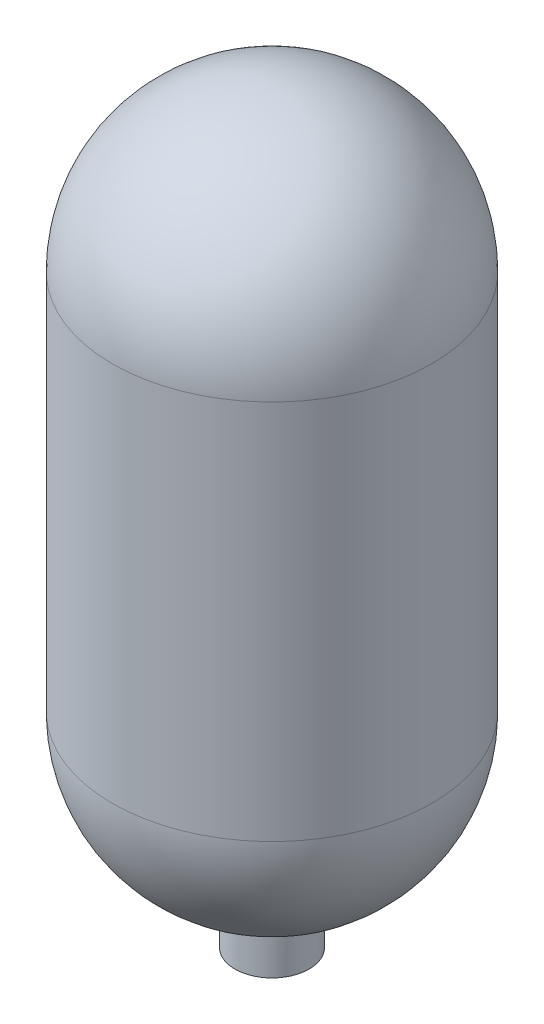
ISO-10303-21;
HEADER;
FILE_DESCRIPTION(('STEP AP214'),'2;1');
FILE_NAME('part.step','',(''),(''),'','','');
FILE_SCHEMA(('AUTOMOTIVE_DESIGN { 1 0 10303 214 1 1 1 1 }'));
ENDSEC;
DATA;
#1=APPLICATION_CONTEXT('core data for automotive mechanical design processes');
#2=APPLICATION_PROTOCOL_DEFINITION('international standard','automotive_design',2000,#1);
#3=PRODUCT_CONTEXT('',#1,'mechanical');
#4=PRODUCT('Part','Part','',(#3));
#5=PRODUCT_RELATED_PRODUCT_CATEGORY('part','',(#4));
#6=PRODUCT_DEFINITION_FORMATION('','',#4);
#7=PRODUCT_DEFINITION_CONTEXT('part definition',#1,'design');
#8=PRODUCT_DEFINITION('design','',#6,#7);
#9=PRODUCT_DEFINITION_SHAPE('','',#8);
#10=(LENGTH_UNIT() NAMED_UNIT(*) SI_UNIT(.MILLI.,.METRE.));
#11=(NAMED_UNIT(*) PLANE_ANGLE_UNIT() SI_UNIT($,.RADIAN.));
#12=(NAMED_UNIT(*) SI_UNIT($,.STERADIAN.) SOLID_ANGLE_UNIT());
#13=UNCERTAINTY_MEASURE_WITH_UNIT(LENGTH_MEASURE(1.E-05),#10,'distance_accuracy_value','');
#14=(GEOMETRIC_REPRESENTATION_CONTEXT(3) GLOBAL_UNCERTAINTY_ASSIGNED_CONTEXT((#13)) GLOBAL_UNIT_ASSIGNED_CONTEXT((#10,
#11,#12)) REPRESENTATION_CONTEXT('',''));
#15=CARTESIAN_POINT('',(0.,0.,0.));
#16=DIRECTION('',(0.,0.,1.));
#17=DIRECTION('',(1.,0.,0.));
#18=AXIS2_PLACEMENT_3D('',#15,#16,#17);
#19=CARTESIAN_POINT('',(0.,0.,0.));
#20=DIRECTION('',(0.,-1.,0.));
#21=DIRECTION('',(0.,0.,-1.));
#22=AXIS2_PLACEMENT_3D('',#19,#20,#21);
#23=PLANE('',#22);
#24=CARTESIAN_POINT('',(0.,0.,0.));
#25=DIRECTION('',(0.,-1.,0.));
#26=DIRECTION('',(0.,0.,-1.));
#27=AXIS2_PLACEMENT_3D('',#24,#25,#26);
#28=CIRCLE('',#27,8.24999999999999);
#29=CARTESIAN_POINT('',(0.,0.,-8.24999999999999));
#30=VERTEX_POINT('',#29);
#31=EDGE_CURVE('E58',#30,#30,#28,.T.);
#32=ORIENTED_EDGE('',*,*,#31,.F.);
#33=EDGE_LOOP('',(#32));
#34=FACE_BOUND('',#33,.T.);
#35=CARTESIAN_POINT('',(0.,0.,0.));
#36=DIRECTION('',(0.,-1.,0.));
#37=DIRECTION('',(0.,0.,-1.));
#38=AXIS2_PLACEMENT_3D('',#35,#36,#37);
#39=CIRCLE('',#38,15.);
#40=CARTESIAN_POINT('',(0.,0.,-15.));
#41=VERTEX_POINT('',#40);
#42=EDGE_CURVE('E46',#41,#41,#39,.T.);
#43=ORIENTED_EDGE('',*,*,#42,.T.);
#44=EDGE_LOOP('',(#43));
#45=FACE_BOUND('',#44,.T.);
#46=ADVANCED_FACE('F35',(#34,#45),#23,.T.);
#47=CARTESIAN_POINT('',(0.,0.,0.));
#48=DIRECTION('',(0.,-1.,0.));
#49=DIRECTION('',(0.,0.,-1.));
#50=AXIS2_PLACEMENT_3D('',#47,#48,#49);
#51=CYLINDRICAL_SURFACE('',#50,15.);
#52=CARTESIAN_POINT('',(0.,16.1714478019781,0.));
#53=DIRECTION('',(0.,1.,0.));
#54=DIRECTION('',(0.,0.,1.));
#55=AXIS2_PLACEMENT_3D('',#52,#53,#54);
#56=CIRCLE('',#55,15.);
#57=CARTESIAN_POINT('',(0.,16.1714478019781,15.));
#58=VERTEX_POINT('',#57);
#59=EDGE_CURVE('E42',#58,#58,#56,.F.);
#60=ORIENTED_EDGE('',*,*,#59,.T.);
#61=EDGE_LOOP('',(#60));
#62=FACE_BOUND('',#61,.T.);
#63=ORIENTED_EDGE('',*,*,#42,.F.);
#64=EDGE_LOOP('',(#63));
#65=FACE_BOUND('',#64,.T.);
#66=ADVANCED_FACE('F108',(#62,#65),#51,.T.);
#67=CARTESIAN_POINT('',(0.,82.7315709989795,0.));
#68=DIRECTION('',(0.,-1.,0.));
#69=DIRECTION('',(1.,0.,0.));
#70=AXIS2_PLACEMENT_3D('',#67,#68,#69);
#71=SPHERICAL_SURFACE('',#70,64.5);
#72=CARTESIAN_POINT('',(0.,20.9599458737048,0.));
#73=DIRECTION('',(0.,1.,0.));
#74=DIRECTION('',(0.,0.,1.));
#75=AXIS2_PLACEMENT_3D('',#72,#73,#74);
#76=CIRCLE('',#75,18.5611510791367);
#77=CARTESIAN_POINT('',(0.,20.9599458737048,18.5611510791367));
#78=VERTEX_POINT('',#77);
#79=EDGE_CURVE('E10',#78,#78,#76,.T.);
#80=ORIENTED_EDGE('',*,*,#79,.T.);
#81=EDGE_LOOP('',(#80));
#82=FACE_BOUND('',#81,.T.);
#83=CARTESIAN_POINT('',(0.,82.7315709989795,0.));
#84=DIRECTION('',(0.,-1.,0.));
#85=DIRECTION('',(0.,0.,-1.));
#86=AXIS2_PLACEMENT_3D('',#83,#84,#85);
#87=CIRCLE('',#86,64.5);
#88=CARTESIAN_POINT('',(0.,82.7315709989795,-64.5));
#89=VERTEX_POINT('',#88);
#90=EDGE_CURVE('E50',#89,#89,#87,.T.);
#91=ORIENTED_EDGE('',*,*,#90,.T.);
#92=EDGE_LOOP('',(#91));
#93=FACE_BOUND('',#92,.T.);
#94=ADVANCED_FACE('F113',(#82,#93),#71,.T.);
#95=CARTESIAN_POINT('',(0.,0.,0.));
#96=DIRECTION('',(0.,-1.,0.));
#97=DIRECTION('',(0.,0.,-1.));
#98=AXIS2_PLACEMENT_3D('',#95,#96,#97);
#99=CYLINDRICAL_SURFACE('',#98,64.5);
#100=CARTESIAN_POINT('',(0.,236.5,0.));
#101=DIRECTION('',(0.,-1.,0.));
#102=DIRECTION('',(0.,0.,-1.));
#103=AXIS2_PLACEMENT_3D('',#100,#101,#102);
#104=CIRCLE('',#103,64.5);
#105=CARTESIAN_POINT('',(0.,236.5,-64.5));
#106=VERTEX_POINT('',#105);
#107=EDGE_CURVE('E55',#106,#106,#104,.T.);
#108=ORIENTED_EDGE('',*,*,#107,.T.);
#109=EDGE_LOOP('',(#108));
#110=FACE_BOUND('',#109,.T.);
#111=ORIENTED_EDGE('',*,*,#90,.F.);
#112=EDGE_LOOP('',(#111));
#113=FACE_BOUND('',#112,.T.);
#114=ADVANCED_FACE('F104',(#110,#113),#99,.T.);
#115=CARTESIAN_POINT('',(0.,236.5,0.));
#116=DIRECTION('',(0.,-1.,0.));
#117=DIRECTION('',(1.,0.,0.));
#118=AXIS2_PLACEMENT_3D('',#115,#116,#117);
#119=SPHERICAL_SURFACE('',#118,64.5);
#120=ORIENTED_EDGE('',*,*,#107,.F.);
#121=EDGE_LOOP('',(#120));
#122=FACE_BOUND('',#121,.T.);
#123=ADVANCED_FACE('F96',(#122),#119,.T.);
#124=CARTESIAN_POINT('',(0.,0.,0.));
#125=DIRECTION('',(0.,-1.,0.));
#126=DIRECTION('',(0.,0.,-1.));
#127=AXIS2_PLACEMENT_3D('',#124,#125,#126);
#128=CYLINDRICAL_SURFACE('',#127,8.24999999999999);
#129=ORIENTED_EDGE('',*,*,#31,.T.);
#130=EDGE_LOOP('',(#129));
#131=FACE_BOUND('',#130,.T.);
#132=CARTESIAN_POINT('',(0.,25.7484439454315,0.));
#133=DIRECTION('',(0.,-1.,0.));
#134=DIRECTION('',(0.,0.,-1.));
#135=AXIS2_PLACEMENT_3D('',#132,#133,#134);
#136=CIRCLE('',#135,8.24999999999999);
#137=CARTESIAN_POINT('',(0.,25.7484439454315,-8.24999999999999));
#138=VERTEX_POINT('',#137);
#139=EDGE_CURVE('E61',#138,#138,#136,.T.);
#140=ORIENTED_EDGE('',*,*,#139,.F.);
#141=EDGE_LOOP('',(#140));
#142=FACE_BOUND('',#141,.T.);
#143=ADVANCED_FACE('F94',(#131,#142),#128,.F.);
#144=CARTESIAN_POINT('',(0.,16.1714478019781,0.));
#145=DIRECTION('',(0.,1.,0.));
#146=DIRECTION('',(0.,0.,1.));
#147=AXIS2_PLACEMENT_3D('',#144,#145,#146);
#148=TOROIDAL_SURFACE('',#147,20.,5.);
#149=ORIENTED_EDGE('',*,*,#79,.F.);
#150=EDGE_LOOP('',(#149));
#151=FACE_BOUND('',#150,.T.);
#152=ORIENTED_EDGE('',*,*,#59,.F.);
#153=EDGE_LOOP('',(#152));
#154=FACE_BOUND('',#153,.T.);
#155=ADVANCED_FACE('F37',(#151,#154),#148,.F.);
#156=CARTESIAN_POINT('',(8.24999999999999,25.7484439454315,0.));
#157=DIRECTION('',(0.,-1.,0.));
#158=DIRECTION('',(0.,0.,-1.));
#159=AXIS2_PLACEMENT_3D('',#156,#157,#158);
#160=PLANE('',#159);
#161=CARTESIAN_POINT('',(0.,25.7484439454315,0.));
#162=DIRECTION('',(0.,-1.,0.));
#163=DIRECTION('',(0.,0.,-1.));
#164=AXIS2_PLACEMENT_3D('',#161,#162,#163);
#165=CIRCLE('',#164,17.1223021582734);
#166=CARTESIAN_POINT('',(0.,25.7484439454315,-17.1223021582734));
#167=VERTEX_POINT('',#166);
#168=EDGE_CURVE('E64',#167,#167,#165,.T.);
#169=ORIENTED_EDGE('',*,*,#168,.F.);
#170=EDGE_LOOP('',(#169));
#171=FACE_BOUND('',#170,.T.);
#172=ORIENTED_EDGE('',*,*,#139,.T.);
#173=EDGE_LOOP('',(#172));
#174=FACE_BOUND('',#173,.T.);
#175=ADVANCED_FACE('F85',(#171,#174),#160,.F.);
#176=CARTESIAN_POINT('',(0.,82.7315709989795,0.));
#177=DIRECTION('',(0.,-1.,0.));
#178=DIRECTION('',(1.,0.,0.));
#179=AXIS2_PLACEMENT_3D('',#176,#177,#178);
#180=SPHERICAL_SURFACE('',#179,59.5);
#181=CARTESIAN_POINT('',(0.,82.7315709989795,0.));
#182=DIRECTION('',(0.,-1.,0.));
#183=DIRECTION('',(0.,0.,-1.));
#184=AXIS2_PLACEMENT_3D('',#181,#182,#183);
#185=CIRCLE('',#184,59.5);
#186=CARTESIAN_POINT('',(0.,82.7315709989795,-59.5));
#187=VERTEX_POINT('',#186);
#188=EDGE_CURVE('E67',#187,#187,#185,.T.);
#189=ORIENTED_EDGE('',*,*,#188,.F.);
#190=EDGE_LOOP('',(#189));
#191=FACE_BOUND('',#190,.T.);
#192=ORIENTED_EDGE('',*,*,#168,.T.);
#193=EDGE_LOOP('',(#192));
#194=FACE_BOUND('',#193,.T.);
#195=ADVANCED_FACE('F79',(#191,#194),#180,.F.);
#196=CARTESIAN_POINT('',(0.,0.,0.));
#197=DIRECTION('',(0.,-1.,0.));
#198=DIRECTION('',(0.,0.,-1.));
#199=AXIS2_PLACEMENT_3D('',#196,#197,#198);
#200=CYLINDRICAL_SURFACE('',#199,59.5);
#201=CARTESIAN_POINT('',(0.,236.5,0.));
#202=DIRECTION('',(0.,-1.,0.));
#203=DIRECTION('',(0.,0.,-1.));
#204=AXIS2_PLACEMENT_3D('',#201,#202,#203);
#205=CIRCLE('',#204,59.5);
#206=CARTESIAN_POINT('',(0.,236.5,-59.5));
#207=VERTEX_POINT('',#206);
#208=EDGE_CURVE('E70',#207,#207,#205,.T.);
#209=ORIENTED_EDGE('',*,*,#208,.F.);
#210=EDGE_LOOP('',(#209));
#211=FACE_BOUND('',#210,.T.);
#212=ORIENTED_EDGE('',*,*,#188,.T.);
#213=EDGE_LOOP('',(#212));
#214=FACE_BOUND('',#213,.T.);
#215=ADVANCED_FACE('F76',(#211,#214),#200,.F.);
#216=CARTESIAN_POINT('',(0.,236.5,0.));
#217=DIRECTION('',(0.,-1.,0.));
#218=DIRECTION('',(1.,0.,0.));
#219=AXIS2_PLACEMENT_3D('',#216,#217,#218);
#220=SPHERICAL_SURFACE('',#219,59.5);
#221=ORIENTED_EDGE('',*,*,#208,.T.);
#222=EDGE_LOOP('',(#221));
#223=FACE_BOUND('',#222,.T.);
#224=ADVANCED_FACE('F74',(#223),#220,.F.);
#225=CLOSED_SHELL('',(#46,#66,#94,#114,#123,#143,#155,#175,#195,#215,#224));
#226=MANIFOLD_SOLID_BREP('B2',#225);
#227=ADVANCED_BREP_SHAPE_REPRESENTATION('',(#18,#226),#14);
#228=SHAPE_DEFINITION_REPRESENTATION(#9,#227);
ENDSEC;
END-ISO-10303-21;
